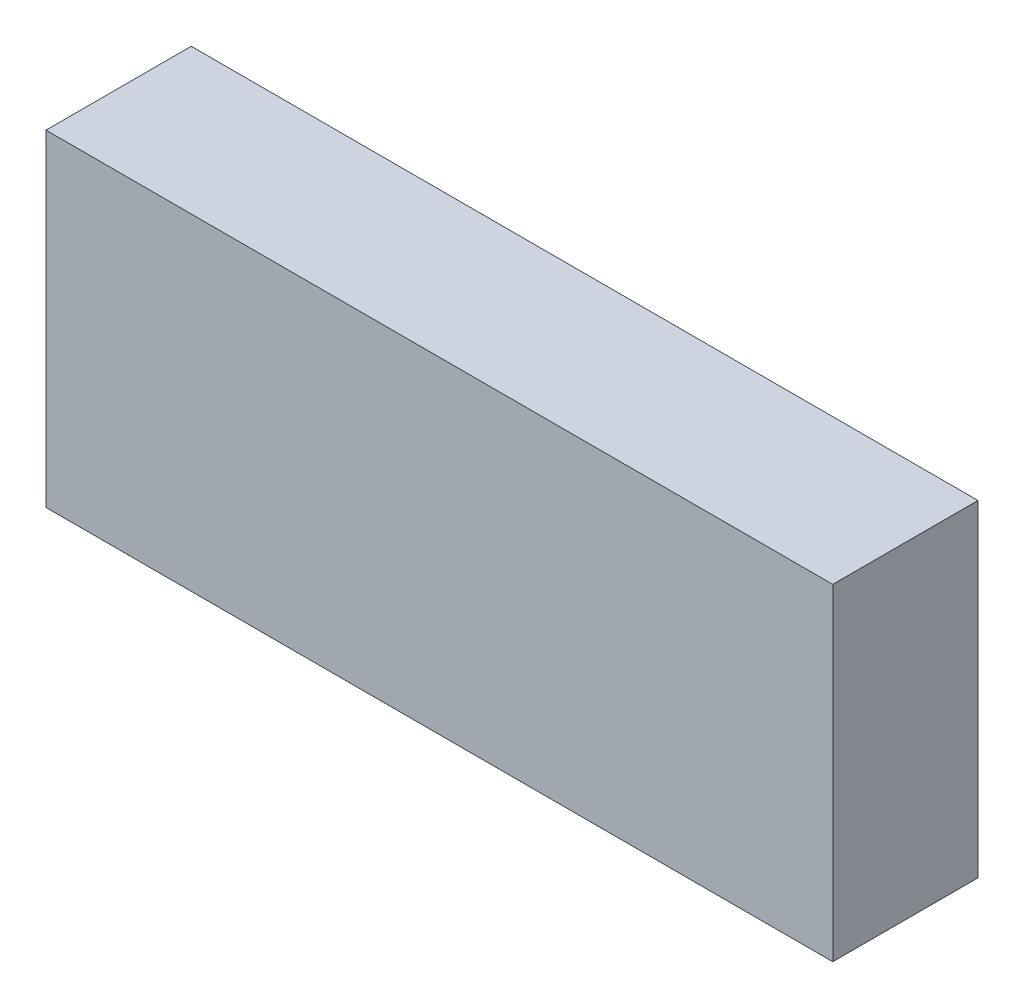
ISO-10303-21;
HEADER;
FILE_DESCRIPTION(('STEP AP214'),'2;1');
FILE_NAME('part.step','',(''),(''),'','','');
FILE_SCHEMA(('AUTOMOTIVE_DESIGN { 1 0 10303 214 1 1 1 1 }'));
ENDSEC;
DATA;
#1=APPLICATION_CONTEXT('core data for automotive mechanical design processes');
#2=APPLICATION_PROTOCOL_DEFINITION('international standard','automotive_design',2000,#1);
#3=PRODUCT_CONTEXT('',#1,'mechanical');
#4=PRODUCT('Part','Part','',(#3));
#5=PRODUCT_RELATED_PRODUCT_CATEGORY('part','',(#4));
#6=PRODUCT_DEFINITION_FORMATION('','',#4);
#7=PRODUCT_DEFINITION_CONTEXT('part definition',#1,'design');
#8=PRODUCT_DEFINITION('design','',#6,#7);
#9=PRODUCT_DEFINITION_SHAPE('','',#8);
#10=(LENGTH_UNIT() NAMED_UNIT(*) SI_UNIT(.MILLI.,.METRE.));
#11=(NAMED_UNIT(*) PLANE_ANGLE_UNIT() SI_UNIT($,.RADIAN.));
#12=(NAMED_UNIT(*) SI_UNIT($,.STERADIAN.) SOLID_ANGLE_UNIT());
#13=UNCERTAINTY_MEASURE_WITH_UNIT(LENGTH_MEASURE(1.E-05),#10,'distance_accuracy_value','');
#14=(GEOMETRIC_REPRESENTATION_CONTEXT(3) GLOBAL_UNCERTAINTY_ASSIGNED_CONTEXT((#13)) GLOBAL_UNIT_ASSIGNED_CONTEXT((#10,
#11,#12)) REPRESENTATION_CONTEXT('',''));
#15=CARTESIAN_POINT('',(0.,0.,0.));
#16=DIRECTION('',(0.,0.,1.));
#17=DIRECTION('',(1.,0.,0.));
#18=AXIS2_PLACEMENT_3D('',#15,#16,#17);
#19=CARTESIAN_POINT('',(-32.5,-13.5,12.));
#20=DIRECTION('',(0.,0.,1.));
#21=DIRECTION('',(1.,0.,0.));
#22=AXIS2_PLACEMENT_3D('',#19,#20,#21);
#23=PLANE('',#22);
#24=DIRECTION('',(0.,1.,0.));
#25=VECTOR('',#24,1.);
#26=CARTESIAN_POINT('',(-32.5,-13.5,12.));
#27=LINE('',#26,#25);
#28=CARTESIAN_POINT('',(-32.5,-13.5,12.));
#29=VERTEX_POINT('',#28);
#30=CARTESIAN_POINT('',(-32.5,13.5,12.));
#31=VERTEX_POINT('',#30);
#32=EDGE_CURVE('E64',#29,#31,#27,.T.);
#33=ORIENTED_EDGE('',*,*,#32,.F.);
#34=DIRECTION('',(1.,0.,0.));
#35=VECTOR('',#34,1.);
#36=CARTESIAN_POINT('',(-32.5,-13.5,12.));
#37=LINE('',#36,#35);
#38=CARTESIAN_POINT('',(32.5,-13.5,12.));
#39=VERTEX_POINT('',#38);
#40=EDGE_CURVE('E58',#29,#39,#37,.T.);
#41=ORIENTED_EDGE('',*,*,#40,.T.);
#42=DIRECTION('',(0.,1.,0.));
#43=VECTOR('',#42,1.);
#44=CARTESIAN_POINT('',(32.5,-13.5,12.));
#45=LINE('',#44,#43);
#46=CARTESIAN_POINT('',(32.5,13.5,12.));
#47=VERTEX_POINT('',#46);
#48=EDGE_CURVE('E60',#39,#47,#45,.T.);
#49=ORIENTED_EDGE('',*,*,#48,.T.);
#50=DIRECTION('',(1.,0.,0.));
#51=VECTOR('',#50,1.);
#52=CARTESIAN_POINT('',(-32.5,13.5,12.));
#53=LINE('',#52,#51);
#54=EDGE_CURVE('E10',#31,#47,#53,.T.);
#55=ORIENTED_EDGE('',*,*,#54,.F.);
#56=EDGE_LOOP('',(#33,#41,#49,#55));
#57=FACE_BOUND('',#56,.T.);
#58=ADVANCED_FACE('F16',(#57),#23,.T.);
#59=CARTESIAN_POINT('',(-32.5,-13.5,0.));
#60=DIRECTION('',(0.,0.,1.));
#61=DIRECTION('',(1.,0.,0.));
#62=AXIS2_PLACEMENT_3D('',#59,#60,#61);
#63=PLANE('',#62);
#64=DIRECTION('',(1.,0.,0.));
#65=VECTOR('',#64,1.);
#66=CARTESIAN_POINT('',(-32.5,13.5,0.));
#67=LINE('',#66,#65);
#68=CARTESIAN_POINT('',(-32.5,13.5,0.));
#69=VERTEX_POINT('',#68);
#70=CARTESIAN_POINT('',(32.5,13.5,0.));
#71=VERTEX_POINT('',#70);
#72=EDGE_CURVE('E26',#69,#71,#67,.T.);
#73=ORIENTED_EDGE('',*,*,#72,.T.);
#74=DIRECTION('',(0.,1.,0.));
#75=VECTOR('',#74,1.);
#76=CARTESIAN_POINT('',(32.5,-13.5,0.));
#77=LINE('',#76,#75);
#78=CARTESIAN_POINT('',(32.5,-13.5,0.));
#79=VERTEX_POINT('',#78);
#80=EDGE_CURVE('E81',#79,#71,#77,.T.);
#81=ORIENTED_EDGE('',*,*,#80,.F.);
#82=DIRECTION('',(1.,0.,0.));
#83=VECTOR('',#82,1.);
#84=CARTESIAN_POINT('',(-32.5,-13.5,0.));
#85=LINE('',#84,#83);
#86=CARTESIAN_POINT('',(-32.5,-13.5,0.));
#87=VERTEX_POINT('',#86);
#88=EDGE_CURVE('E19',#87,#79,#85,.T.);
#89=ORIENTED_EDGE('',*,*,#88,.F.);
#90=DIRECTION('',(0.,1.,0.));
#91=VECTOR('',#90,1.);
#92=CARTESIAN_POINT('',(-32.5,-13.5,0.));
#93=LINE('',#92,#91);
#94=EDGE_CURVE('E88',#87,#69,#93,.T.);
#95=ORIENTED_EDGE('',*,*,#94,.T.);
#96=EDGE_LOOP('',(#73,#81,#89,#95));
#97=FACE_BOUND('',#96,.T.);
#98=ADVANCED_FACE('F129',(#97),#63,.F.);
#99=CARTESIAN_POINT('',(-32.5,13.5,0.));
#100=DIRECTION('',(0.,1.,0.));
#101=DIRECTION('',(1.,0.,0.));
#102=AXIS2_PLACEMENT_3D('',#99,#100,#101);
#103=PLANE('',#102);
#104=ORIENTED_EDGE('',*,*,#72,.F.);
#105=DIRECTION('',(0.,0.,1.));
#106=VECTOR('',#105,1.);
#107=CARTESIAN_POINT('',(-32.5,13.5,0.));
#108=LINE('',#107,#106);
#109=EDGE_CURVE('E152',#69,#31,#108,.T.);
#110=ORIENTED_EDGE('',*,*,#109,.T.);
#111=ORIENTED_EDGE('',*,*,#54,.T.);
#112=DIRECTION('',(0.,0.,1.));
#113=VECTOR('',#112,1.);
#114=CARTESIAN_POINT('',(32.5,13.5,0.));
#115=LINE('',#114,#113);
#116=EDGE_CURVE('E75',#71,#47,#115,.T.);
#117=ORIENTED_EDGE('',*,*,#116,.F.);
#118=EDGE_LOOP('',(#104,#110,#111,#117));
#119=FACE_BOUND('',#118,.T.);
#120=ADVANCED_FACE('F122',(#119),#103,.T.);
#121=CARTESIAN_POINT('',(-32.5,-13.5,0.));
#122=DIRECTION('',(0.,1.,0.));
#123=DIRECTION('',(1.,0.,0.));
#124=AXIS2_PLACEMENT_3D('',#121,#122,#123);
#125=PLANE('',#124);
#126=DIRECTION('',(0.,0.,1.));
#127=VECTOR('',#126,1.);
#128=CARTESIAN_POINT('',(32.5,-13.5,0.));
#129=LINE('',#128,#127);
#130=EDGE_CURVE('E74',#79,#39,#129,.T.);
#131=ORIENTED_EDGE('',*,*,#130,.T.);
#132=ORIENTED_EDGE('',*,*,#40,.F.);
#133=DIRECTION('',(0.,0.,1.));
#134=VECTOR('',#133,1.);
#135=CARTESIAN_POINT('',(-32.5,-13.5,0.));
#136=LINE('',#135,#134);
#137=EDGE_CURVE('E82',#87,#29,#136,.T.);
#138=ORIENTED_EDGE('',*,*,#137,.F.);
#139=ORIENTED_EDGE('',*,*,#88,.T.);
#140=EDGE_LOOP('',(#131,#132,#138,#139));
#141=FACE_BOUND('',#140,.T.);
#142=ADVANCED_FACE('F78',(#141),#125,.F.);
#143=CARTESIAN_POINT('',(32.5,-13.5,0.));
#144=DIRECTION('',(1.,0.,0.));
#145=DIRECTION('',(0.,1.,0.));
#146=AXIS2_PLACEMENT_3D('',#143,#144,#145);
#147=PLANE('',#146);
#148=ORIENTED_EDGE('',*,*,#130,.F.);
#149=ORIENTED_EDGE('',*,*,#80,.T.);
#150=ORIENTED_EDGE('',*,*,#116,.T.);
#151=ORIENTED_EDGE('',*,*,#48,.F.);
#152=EDGE_LOOP('',(#148,#149,#150,#151));
#153=FACE_BOUND('',#152,.T.);
#154=ADVANCED_FACE('F72',(#153),#147,.T.);
#155=CARTESIAN_POINT('',(-32.5,-13.5,0.));
#156=DIRECTION('',(1.,0.,0.));
#157=DIRECTION('',(0.,1.,0.));
#158=AXIS2_PLACEMENT_3D('',#155,#156,#157);
#159=PLANE('',#158);
#160=ORIENTED_EDGE('',*,*,#32,.T.);
#161=ORIENTED_EDGE('',*,*,#109,.F.);
#162=ORIENTED_EDGE('',*,*,#94,.F.);
#163=ORIENTED_EDGE('',*,*,#137,.T.);
#164=EDGE_LOOP('',(#160,#161,#162,#163));
#165=FACE_BOUND('',#164,.T.);
#166=ADVANCED_FACE('F103',(#165),#159,.F.);
#167=CLOSED_SHELL('',(#58,#98,#120,#142,#154,#166));
#168=MANIFOLD_SOLID_BREP('B1',#167);
#169=ADVANCED_BREP_SHAPE_REPRESENTATION('',(#18,#168),#14);
#170=SHAPE_DEFINITION_REPRESENTATION(#9,#169);
ENDSEC;
END-ISO-10303-21;
